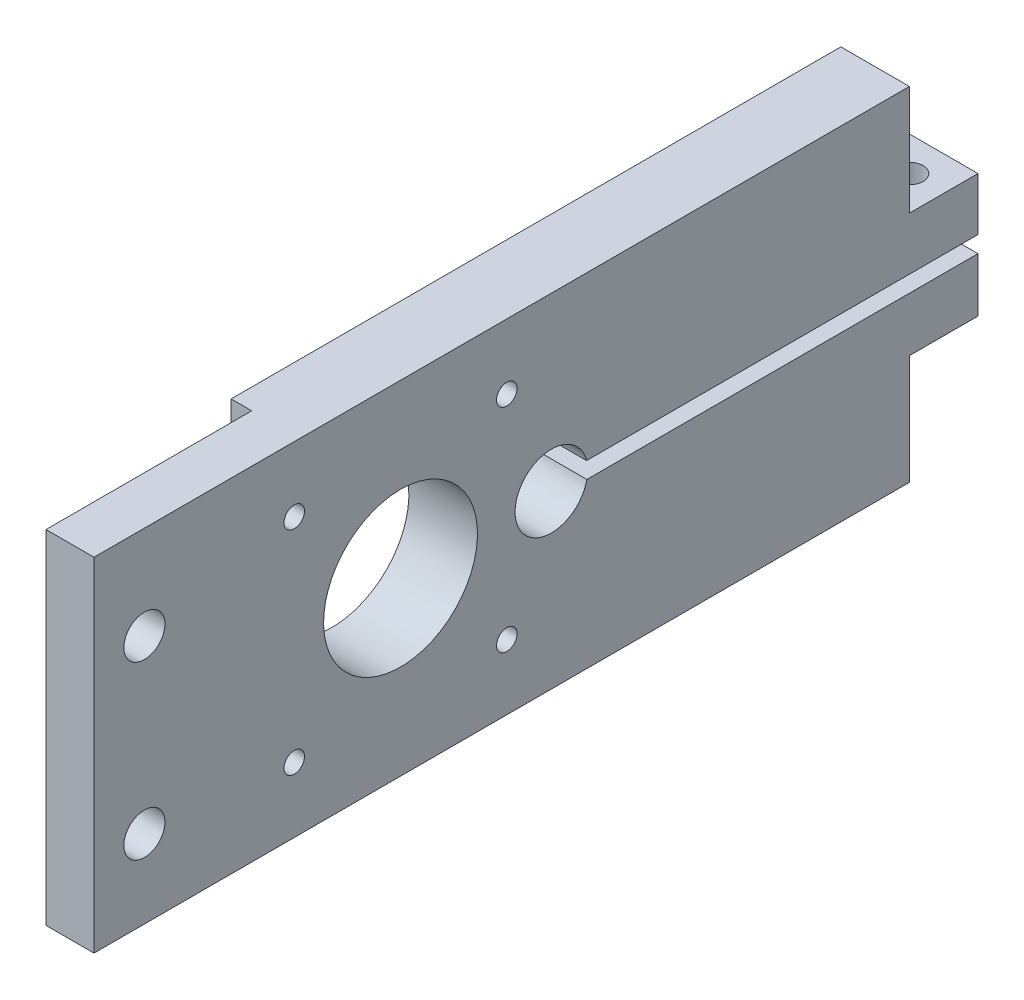
ISO-10303-21;
HEADER;
FILE_DESCRIPTION(('STEP AP214'),'2;1');
FILE_NAME('part.step','',(''),(''),'','','');
FILE_SCHEMA(('AUTOMOTIVE_DESIGN { 1 0 10303 214 1 1 1 1 }'));
ENDSEC;
DATA;
#1=APPLICATION_CONTEXT('core data for automotive mechanical design processes');
#2=APPLICATION_PROTOCOL_DEFINITION('international standard','automotive_design',2000,#1);
#3=PRODUCT_CONTEXT('',#1,'mechanical');
#4=PRODUCT('Part','Part','',(#3));
#5=PRODUCT_RELATED_PRODUCT_CATEGORY('part','',(#4));
#6=PRODUCT_DEFINITION_FORMATION('','',#4);
#7=PRODUCT_DEFINITION_CONTEXT('part definition',#1,'design');
#8=PRODUCT_DEFINITION('design','',#6,#7);
#9=PRODUCT_DEFINITION_SHAPE('','',#8);
#10=(LENGTH_UNIT() NAMED_UNIT(*) SI_UNIT(.MILLI.,.METRE.));
#11=(NAMED_UNIT(*) PLANE_ANGLE_UNIT() SI_UNIT($,.RADIAN.));
#12=(NAMED_UNIT(*) SI_UNIT($,.STERADIAN.) SOLID_ANGLE_UNIT());
#13=UNCERTAINTY_MEASURE_WITH_UNIT(LENGTH_MEASURE(1.E-05),#10,'distance_accuracy_value','');
#14=(GEOMETRIC_REPRESENTATION_CONTEXT(3) GLOBAL_UNCERTAINTY_ASSIGNED_CONTEXT((#13)) GLOBAL_UNIT_ASSIGNED_CONTEXT((#10,
#11,#12)) REPRESENTATION_CONTEXT('',''));
#15=CARTESIAN_POINT('',(0.,0.,0.));
#16=DIRECTION('',(0.,0.,1.));
#17=DIRECTION('',(1.,0.,0.));
#18=AXIS2_PLACEMENT_3D('',#15,#16,#17);
#19=CARTESIAN_POINT('',(76.0000000000001,0.,0.));
#20=DIRECTION('',(1.,0.,0.));
#21=DIRECTION('',(0.,1.,0.));
#22=AXIS2_PLACEMENT_3D('',#19,#20,#21);
#23=PLANE('',#22);
#24=DIRECTION('',(0.,0.,-1.));
#25=VECTOR('',#24,1.);
#26=CARTESIAN_POINT('',(76.0000000000001,266.,-111.216548797109));
#27=LINE('',#26,#25);
#28=CARTESIAN_POINT('',(76.0000000000001,266.,-101.216548797109));
#29=VERTEX_POINT('',#28);
#30=CARTESIAN_POINT('',(76.0000000000001,266.,-111.216548797109));
#31=VERTEX_POINT('',#30);
#32=EDGE_CURVE('E168',#29,#31,#27,.T.);
#33=ORIENTED_EDGE('',*,*,#32,.T.);
#34=DIRECTION('',(0.,-1.,0.));
#35=VECTOR('',#34,1.);
#36=CARTESIAN_POINT('',(76.0000000000001,273.885605854486,-111.216548797109));
#37=LINE('',#36,#35);
#38=CARTESIAN_POINT('',(76.0000000000001,273.885605854486,-111.216548797109));
#39=VERTEX_POINT('',#38);
#40=EDGE_CURVE('E248',#39,#31,#37,.T.);
#41=ORIENTED_EDGE('',*,*,#40,.F.);
#42=DIRECTION('',(0.,0.,-1.));
#43=VECTOR('',#42,1.);
#44=CARTESIAN_POINT('',(76.0000000000001,273.885605854486,-49.5274257157044));
#45=LINE('',#44,#43);
#46=CARTESIAN_POINT('',(76.0000000000001,273.885605854486,-54.1768743402864));
#47=VERTEX_POINT('',#46);
#48=EDGE_CURVE('E256',#47,#39,#45,.T.);
#49=ORIENTED_EDGE('',*,*,#48,.F.);
#50=CARTESIAN_POINT('',(76.0000000000001,275.000000000006,-48.9999999999999));
#51=DIRECTION('',(1.,0.,0.));
#52=DIRECTION('',(0.,1.,0.));
#53=AXIS2_PLACEMENT_3D('',#50,#51,#52);
#54=CIRCLE('',#53,5.29546053206766);
#55=CARTESIAN_POINT('',(76.0000000000001,276.289745616525,-54.1359963484562));
#56=VERTEX_POINT('',#55);
#57=EDGE_CURVE('E294',#56,#47,#54,.T.);
#58=ORIENTED_EDGE('',*,*,#57,.F.);
#59=DIRECTION('',(0.,0.,1.));
#60=VECTOR('',#59,1.);
#61=CARTESIAN_POINT('',(76.0000000000002,276.289745616525,-108.216548797109));
#62=LINE('',#61,#60);
#63=CARTESIAN_POINT('',(76.0000000000002,276.289745616525,-111.216548797109));
#64=VERTEX_POINT('',#63);
#65=EDGE_CURVE('E251',#64,#56,#62,.T.);
#66=ORIENTED_EDGE('',*,*,#65,.F.);
#67=DIRECTION('',(0.,-1.,0.));
#68=VECTOR('',#67,1.);
#69=CARTESIAN_POINT('',(76.0000000000001,300.000000000006,-111.216548797109));
#70=LINE('',#69,#68);
#71=CARTESIAN_POINT('',(76.0000000000002,284.000000000006,-111.216548797109));
#72=VERTEX_POINT('',#71);
#73=EDGE_CURVE('E235',#72,#64,#70,.T.);
#74=ORIENTED_EDGE('',*,*,#73,.F.);
#75=DIRECTION('',(0.,0.,1.));
#76=VECTOR('',#75,1.);
#77=CARTESIAN_POINT('',(76.0000000000002,284.000000000006,-111.216548797109));
#78=LINE('',#77,#76);
#79=CARTESIAN_POINT('',(76.0000000000002,284.000000000006,-101.216548797109));
#80=VERTEX_POINT('',#79);
#81=EDGE_CURVE('E57',#72,#80,#78,.T.);
#82=ORIENTED_EDGE('',*,*,#81,.T.);
#83=DIRECTION('',(0.,1.,0.));
#84=VECTOR('',#83,1.);
#85=CARTESIAN_POINT('',(76.0000000000002,300.000000000006,-101.216548797109));
#86=LINE('',#85,#84);
#87=CARTESIAN_POINT('',(76.0000000000002,300.000000000006,-101.216548797109));
#88=VERTEX_POINT('',#87);
#89=EDGE_CURVE('E231',#80,#88,#86,.T.);
#90=ORIENTED_EDGE('',*,*,#89,.T.);
#91=DIRECTION('',(0.,0.,1.));
#92=VECTOR('',#91,1.);
#93=CARTESIAN_POINT('',(76.0000000000001,300.000000000006,-47.9999999999999));
#94=LINE('',#93,#92);
#95=CARTESIAN_POINT('',(76.0000000000002,300.000000000006,17.7021500089913));
#96=VERTEX_POINT('',#95);
#97=EDGE_CURVE('E184',#88,#96,#94,.T.);
#98=ORIENTED_EDGE('',*,*,#97,.T.);
#99=DIRECTION('',(0.,-1.,0.));
#100=VECTOR('',#99,1.);
#101=CARTESIAN_POINT('',(76.0000000000002,300.000000000006,17.7021500089913));
#102=LINE('',#101,#100);
#103=CARTESIAN_POINT('',(76.0000000000001,250.000000000006,17.7021500089913));
#104=VERTEX_POINT('',#103);
#105=EDGE_CURVE('E182',#96,#104,#102,.T.);
#106=ORIENTED_EDGE('',*,*,#105,.T.);
#107=DIRECTION('',(0.,0.,-1.));
#108=VECTOR('',#107,1.);
#109=CARTESIAN_POINT('',(76.0000000000001,250.,-108.216548797109));
#110=LINE('',#109,#108);
#111=CARTESIAN_POINT('',(76.0000000000001,250.,-101.216548797109));
#112=VERTEX_POINT('',#111);
#113=EDGE_CURVE('E174',#104,#112,#110,.T.);
#114=ORIENTED_EDGE('',*,*,#113,.T.);
#115=DIRECTION('',(0.,1.,0.));
#116=VECTOR('',#115,1.);
#117=CARTESIAN_POINT('',(76.0000000000001,250.,-101.216548797109));
#118=LINE('',#117,#116);
#119=EDGE_CURVE('E157',#112,#29,#118,.T.);
#120=ORIENTED_EDGE('',*,*,#119,.T.);
#121=EDGE_LOOP('',(#33,#41,#49,#58,#66,#74,#82,#90,#98,#106,#114,#120));
#122=FACE_BOUND('',#121,.T.);
#123=CARTESIAN_POINT('',(76.0000000000001,261.401714799848,10.3510750044957));
#124=DIRECTION('',(1.,0.,0.));
#125=DIRECTION('',(0.,1.,0.));
#126=AXIS2_PLACEMENT_3D('',#123,#124,#125);
#127=CIRCLE('',#126,3.00000000000185);
#128=CARTESIAN_POINT('',(76.0000000000001,264.40171479985,10.3510750044957));
#129=VERTEX_POINT('',#128);
#130=EDGE_CURVE('E297',#129,#129,#127,.T.);
#131=ORIENTED_EDGE('',*,*,#130,.F.);
#132=EDGE_LOOP('',(#131));
#133=FACE_BOUND('',#132,.T.);
#134=CARTESIAN_POINT('',(76.0000000000001,275.000000000006,-26.9999999999999));
#135=DIRECTION('',(1.,0.,0.));
#136=DIRECTION('',(0.,1.,0.));
#137=AXIS2_PLACEMENT_3D('',#134,#135,#136);
#138=CIRCLE('',#137,11.2232575209576);
#139=CARTESIAN_POINT('',(76.0000000000001,286.223257520963,-26.9999999999999));
#140=VERTEX_POINT('',#139);
#141=EDGE_CURVE('E306',#140,#140,#138,.T.);
#142=ORIENTED_EDGE('',*,*,#141,.F.);
#143=EDGE_LOOP('',(#142));
#144=FACE_BOUND('',#143,.T.);
#145=CARTESIAN_POINT('',(76.0000000000001,259.500000000006,-11.4999999999997));
#146=DIRECTION('',(1.,0.,0.));
#147=DIRECTION('',(0.,1.,0.));
#148=AXIS2_PLACEMENT_3D('',#145,#146,#147);
#149=CIRCLE('',#148,1.50000000000001);
#150=CARTESIAN_POINT('',(76.0000000000001,261.000000000006,-11.4999999999997));
#151=VERTEX_POINT('',#150);
#152=EDGE_CURVE('E318',#151,#151,#149,.T.);
#153=ORIENTED_EDGE('',*,*,#152,.F.);
#154=EDGE_LOOP('',(#153));
#155=FACE_BOUND('',#154,.T.);
#156=CARTESIAN_POINT('',(76.0000000000001,259.500000000006,-42.4999999999997));
#157=DIRECTION('',(1.,0.,0.));
#158=DIRECTION('',(0.,1.,0.));
#159=AXIS2_PLACEMENT_3D('',#156,#157,#158);
#160=CIRCLE('',#159,1.49999999999995);
#161=CARTESIAN_POINT('',(76.0000000000001,261.000000000006,-42.4999999999997));
#162=VERTEX_POINT('',#161);
#163=EDGE_CURVE('E195',#162,#162,#160,.T.);
#164=ORIENTED_EDGE('',*,*,#163,.F.);
#165=EDGE_LOOP('',(#164));
#166=FACE_BOUND('',#165,.T.);
#167=CARTESIAN_POINT('',(76.0000000000001,290.500000000006,-42.4999999999999));
#168=DIRECTION('',(1.,0.,0.));
#169=DIRECTION('',(0.,1.,0.));
#170=AXIS2_PLACEMENT_3D('',#167,#168,#169);
#171=CIRCLE('',#170,1.49999999999995);
#172=CARTESIAN_POINT('',(76.0000000000001,292.000000000006,-42.4999999999999));
#173=VERTEX_POINT('',#172);
#174=EDGE_CURVE('E324',#173,#173,#171,.T.);
#175=ORIENTED_EDGE('',*,*,#174,.F.);
#176=EDGE_LOOP('',(#175));
#177=FACE_BOUND('',#176,.T.);
#178=CARTESIAN_POINT('',(76.0000000000001,290.500000000006,-11.4999999999999));
#179=DIRECTION('',(1.,0.,0.));
#180=DIRECTION('',(0.,1.,0.));
#181=AXIS2_PLACEMENT_3D('',#178,#179,#180);
#182=CIRCLE('',#181,1.50000000000001);
#183=CARTESIAN_POINT('',(76.0000000000001,292.000000000006,-11.4999999999999));
#184=VERTEX_POINT('',#183);
#185=EDGE_CURVE('E312',#184,#184,#182,.T.);
#186=ORIENTED_EDGE('',*,*,#185,.F.);
#187=EDGE_LOOP('',(#186));
#188=FACE_BOUND('',#187,.T.);
#189=CARTESIAN_POINT('',(76.0000000000001,286.401714799848,10.3510750044957));
#190=DIRECTION('',(1.,0.,0.));
#191=DIRECTION('',(0.,1.,0.));
#192=AXIS2_PLACEMENT_3D('',#189,#190,#191);
#193=CIRCLE('',#192,3.00000000000185);
#194=CARTESIAN_POINT('',(76.0000000000001,289.40171479985,10.3510750044957));
#195=VERTEX_POINT('',#194);
#196=EDGE_CURVE('E302',#195,#195,#193,.T.);
#197=ORIENTED_EDGE('',*,*,#196,.F.);
#198=EDGE_LOOP('',(#197));
#199=FACE_BOUND('',#198,.T.);
#200=ADVANCED_FACE('F32',(#122,#133,#144,#155,#166,#177,#188,#199),#23,.T.);
#201=CARTESIAN_POINT('',(66.0000000000001,0.,0.));
#202=DIRECTION('',(1.,0.,0.));
#203=DIRECTION('',(0.,1.,0.));
#204=AXIS2_PLACEMENT_3D('',#201,#202,#203);
#205=PLANE('',#204);
#206=CARTESIAN_POINT('',(66.0000000000001,259.500000000006,-42.4999999999997));
#207=DIRECTION('',(1.,0.,0.));
#208=DIRECTION('',(0.,1.,0.));
#209=AXIS2_PLACEMENT_3D('',#206,#207,#208);
#210=CIRCLE('',#209,1.49999999999995);
#211=CARTESIAN_POINT('',(66.0000000000001,261.000000000006,-42.4999999999997));
#212=VERTEX_POINT('',#211);
#213=EDGE_CURVE('E190',#212,#212,#210,.T.);
#214=ORIENTED_EDGE('',*,*,#213,.T.);
#215=EDGE_LOOP('',(#214));
#216=FACE_BOUND('',#215,.T.);
#217=CARTESIAN_POINT('',(66.0000000000001,290.500000000006,-42.4999999999999));
#218=DIRECTION('',(1.,0.,0.));
#219=DIRECTION('',(0.,1.,0.));
#220=AXIS2_PLACEMENT_3D('',#217,#218,#219);
#221=CIRCLE('',#220,1.49999999999995);
#222=CARTESIAN_POINT('',(66.0000000000001,292.000000000006,-42.4999999999999));
#223=VERTEX_POINT('',#222);
#224=EDGE_CURVE('E321',#223,#223,#221,.T.);
#225=ORIENTED_EDGE('',*,*,#224,.T.);
#226=EDGE_LOOP('',(#225));
#227=FACE_BOUND('',#226,.T.);
#228=DIRECTION('',(0.,1.,0.));
#229=VECTOR('',#228,1.);
#230=CARTESIAN_POINT('',(66.0000000000001,250.,-111.216548797109));
#231=LINE('',#230,#229);
#232=CARTESIAN_POINT('',(66.0000000000001,266.,-111.216548797109));
#233=VERTEX_POINT('',#232);
#234=CARTESIAN_POINT('',(66.0000000000001,273.885605854486,-111.216548797109));
#235=VERTEX_POINT('',#234);
#236=EDGE_CURVE('E243',#233,#235,#231,.T.);
#237=ORIENTED_EDGE('',*,*,#236,.F.);
#238=DIRECTION('',(0.,0.,-1.));
#239=VECTOR('',#238,1.);
#240=CARTESIAN_POINT('',(66.0000000000001,266.,-111.216548797109));
#241=LINE('',#240,#239);
#242=CARTESIAN_POINT('',(66.0000000000001,266.,-101.216548797109));
#243=VERTEX_POINT('',#242);
#244=EDGE_CURVE('E49',#243,#233,#241,.T.);
#245=ORIENTED_EDGE('',*,*,#244,.F.);
#246=DIRECTION('',(0.,1.,0.));
#247=VECTOR('',#246,1.);
#248=CARTESIAN_POINT('',(66.0000000000001,250.,-101.216548797109));
#249=LINE('',#248,#247);
#250=CARTESIAN_POINT('',(66.0000000000001,250.,-101.216548797109));
#251=VERTEX_POINT('',#250);
#252=EDGE_CURVE('E376',#251,#243,#249,.T.);
#253=ORIENTED_EDGE('',*,*,#252,.F.);
#254=DIRECTION('',(0.,0.,-1.));
#255=VECTOR('',#254,1.);
#256=CARTESIAN_POINT('',(66.0000000000001,250.000000000006,-47.9999999999999));
#257=LINE('',#256,#255);
#258=CARTESIAN_POINT('',(66.0000000000001,250.000000000006,-12.2978499910087));
#259=VERTEX_POINT('',#258);
#260=EDGE_CURVE('E178',#259,#251,#257,.T.);
#261=ORIENTED_EDGE('',*,*,#260,.F.);
#262=DIRECTION('',(0.,-1.,0.));
#263=VECTOR('',#262,1.);
#264=CARTESIAN_POINT('',(66.0000000000002,300.000000000006,-12.2978499910087));
#265=LINE('',#264,#263);
#266=CARTESIAN_POINT('',(66.0000000000001,258.229789233303,-12.2978499910087));
#267=VERTEX_POINT('',#266);
#268=EDGE_CURVE('E269',#267,#259,#265,.T.);
#269=ORIENTED_EDGE('',*,*,#268,.F.);
#270=CARTESIAN_POINT('',(66.0000000000001,259.500000000006,-11.4999999999997));
#271=DIRECTION('',(1.,0.,0.));
#272=DIRECTION('',(0.,1.,0.));
#273=AXIS2_PLACEMENT_3D('',#270,#271,#272);
#274=CIRCLE('',#273,1.50000000000001);
#275=CARTESIAN_POINT('',(66.0000000000001,260.770210766708,-12.2978499910087));
#276=VERTEX_POINT('',#275);
#277=EDGE_CURVE('E315',#267,#276,#274,.T.);
#278=ORIENTED_EDGE('',*,*,#277,.T.);
#279=CARTESIAN_POINT('',(66.0000000000002,289.229789233303,-12.2978499910087));
#280=VERTEX_POINT('',#279);
#281=EDGE_CURVE('E282',#280,#276,#265,.T.);
#282=ORIENTED_EDGE('',*,*,#281,.F.);
#283=CARTESIAN_POINT('',(66.0000000000001,290.500000000006,-11.4999999999999));
#284=DIRECTION('',(1.,0.,0.));
#285=DIRECTION('',(0.,1.,0.));
#286=AXIS2_PLACEMENT_3D('',#283,#284,#285);
#287=CIRCLE('',#286,1.50000000000001);
#288=CARTESIAN_POINT('',(66.0000000000001,291.770210766709,-12.2978499910087));
#289=VERTEX_POINT('',#288);
#290=EDGE_CURVE('E309',#280,#289,#287,.T.);
#291=ORIENTED_EDGE('',*,*,#290,.T.);
#292=CARTESIAN_POINT('',(66.0000000000002,300.000000000006,-12.2978499910087));
#293=VERTEX_POINT('',#292);
#294=EDGE_CURVE('E280',#293,#289,#265,.T.);
#295=ORIENTED_EDGE('',*,*,#294,.F.);
#296=DIRECTION('',(0.,0.,1.));
#297=VECTOR('',#296,1.);
#298=CARTESIAN_POINT('',(66.0000000000001,300.000000000006,3.00000000000014));
#299=LINE('',#298,#297);
#300=CARTESIAN_POINT('',(66.0000000000002,300.000000000006,-101.216548797109));
#301=VERTEX_POINT('',#300);
#302=EDGE_CURVE('E187',#301,#293,#299,.T.);
#303=ORIENTED_EDGE('',*,*,#302,.F.);
#304=DIRECTION('',(0.,1.,0.));
#305=VECTOR('',#304,1.);
#306=CARTESIAN_POINT('',(66.0000000000002,300.000000000006,-101.216548797109));
#307=LINE('',#306,#305);
#308=CARTESIAN_POINT('',(66.0000000000002,284.000000000006,-101.216548797109));
#309=VERTEX_POINT('',#308);
#310=EDGE_CURVE('E228',#309,#301,#307,.T.);
#311=ORIENTED_EDGE('',*,*,#310,.F.);
#312=DIRECTION('',(0.,0.,1.));
#313=VECTOR('',#312,1.);
#314=CARTESIAN_POINT('',(66.0000000000002,284.000000000006,-111.216548797109));
#315=LINE('',#314,#313);
#316=CARTESIAN_POINT('',(66.0000000000002,284.000000000006,-111.216548797109));
#317=VERTEX_POINT('',#316);
#318=EDGE_CURVE('E386',#317,#309,#315,.T.);
#319=ORIENTED_EDGE('',*,*,#318,.F.);
#320=DIRECTION('',(0.,1.,0.));
#321=VECTOR('',#320,1.);
#322=CARTESIAN_POINT('',(66.0000000000002,276.289745616525,-111.216548797109));
#323=LINE('',#322,#321);
#324=CARTESIAN_POINT('',(66.0000000000002,276.289745616525,-111.216548797109));
#325=VERTEX_POINT('',#324);
#326=EDGE_CURVE('E240',#325,#317,#323,.T.);
#327=ORIENTED_EDGE('',*,*,#326,.F.);
#328=DIRECTION('',(0.,0.,1.));
#329=VECTOR('',#328,1.);
#330=CARTESIAN_POINT('',(66.0000000000002,276.289745616525,-109.527425715704));
#331=LINE('',#330,#329);
#332=CARTESIAN_POINT('',(66.0000000000002,276.289745616525,-54.1359963484562));
#333=VERTEX_POINT('',#332);
#334=EDGE_CURVE('E252',#325,#333,#331,.T.);
#335=ORIENTED_EDGE('',*,*,#334,.T.);
#336=CARTESIAN_POINT('',(66.0000000000001,275.000000000006,-48.9999999999999));
#337=DIRECTION('',(1.,0.,0.));
#338=DIRECTION('',(0.,1.,0.));
#339=AXIS2_PLACEMENT_3D('',#336,#337,#338);
#340=CIRCLE('',#339,5.29546053206766);
#341=CARTESIAN_POINT('',(66.0000000000001,273.885605854486,-54.1768743402864));
#342=VERTEX_POINT('',#341);
#343=EDGE_CURVE('E293',#333,#342,#340,.T.);
#344=ORIENTED_EDGE('',*,*,#343,.T.);
#345=DIRECTION('',(0.,0.,-1.));
#346=VECTOR('',#345,1.);
#347=CARTESIAN_POINT('',(66.0000000000001,273.885605854486,-49.5274257157044));
#348=LINE('',#347,#346);
#349=EDGE_CURVE('E255',#342,#235,#348,.T.);
#350=ORIENTED_EDGE('',*,*,#349,.T.);
#351=EDGE_LOOP('',(#237,#245,#253,#261,#269,#278,#282,#291,#295,#303,#311,#319,#327,#335,#344,#350));
#352=FACE_BOUND('',#351,.T.);
#353=CARTESIAN_POINT('',(66.0000000000001,275.000000000006,-26.9999999999999));
#354=DIRECTION('',(1.,0.,0.));
#355=DIRECTION('',(0.,1.,0.));
#356=AXIS2_PLACEMENT_3D('',#353,#354,#355);
#357=CIRCLE('',#356,11.2232575209576);
#358=CARTESIAN_POINT('',(66.0000000000001,286.223257520963,-26.9999999999999));
#359=VERTEX_POINT('',#358);
#360=EDGE_CURVE('E305',#359,#359,#357,.T.);
#361=ORIENTED_EDGE('',*,*,#360,.T.);
#362=EDGE_LOOP('',(#361));
#363=FACE_BOUND('',#362,.T.);
#364=ADVANCED_FACE('F334',(#216,#227,#352,#363),#205,.F.);
#365=CARTESIAN_POINT('',(76.0000000000001,300.000000000006,3.00000000000014));
#366=DIRECTION('',(0.,-1.,0.));
#367=DIRECTION('',(1.,0.,0.));
#368=AXIS2_PLACEMENT_3D('',#365,#366,#367);
#369=PLANE('',#368);
#370=ORIENTED_EDGE('',*,*,#97,.F.);
#371=DIRECTION('',(-1.,0.,0.));
#372=VECTOR('',#371,1.);
#373=CARTESIAN_POINT('',(76.0000000000002,300.000000000006,-101.216548797109));
#374=LINE('',#373,#372);
#375=EDGE_CURVE('E213',#88,#301,#374,.T.);
#376=ORIENTED_EDGE('',*,*,#375,.T.);
#377=ORIENTED_EDGE('',*,*,#302,.T.);
#378=DIRECTION('',(1.,0.,0.));
#379=VECTOR('',#378,1.);
#380=CARTESIAN_POINT('',(69.0000000000003,300.000000000006,-12.2978499910087));
#381=LINE('',#380,#379);
#382=CARTESIAN_POINT('',(69.0000000000003,300.000000000006,-12.2978499910087));
#383=VERTEX_POINT('',#382);
#384=EDGE_CURVE('E262',#293,#383,#381,.T.);
#385=ORIENTED_EDGE('',*,*,#384,.T.);
#386=DIRECTION('',(0.,0.,1.));
#387=VECTOR('',#386,1.);
#388=CARTESIAN_POINT('',(69.0000000000003,300.000000000006,17.7021500089913));
#389=LINE('',#388,#387);
#390=CARTESIAN_POINT('',(69.0000000000003,300.000000000006,17.7021500089913));
#391=VERTEX_POINT('',#390);
#392=EDGE_CURVE('E265',#383,#391,#389,.T.);
#393=ORIENTED_EDGE('',*,*,#392,.T.);
#394=DIRECTION('',(-1.,0.,0.));
#395=VECTOR('',#394,1.);
#396=CARTESIAN_POINT('',(76.0000000000002,300.000000000006,17.7021500089913));
#397=LINE('',#396,#395);
#398=EDGE_CURVE('E198',#96,#391,#397,.T.);
#399=ORIENTED_EDGE('',*,*,#398,.F.);
#400=EDGE_LOOP('',(#370,#376,#377,#385,#393,#399));
#401=FACE_BOUND('',#400,.T.);
#402=ADVANCED_FACE('F34',(#401),#369,.F.);
#403=CARTESIAN_POINT('',(76.0000000000002,300.000000000006,17.7021500089913));
#404=DIRECTION('',(0.,0.,-1.));
#405=DIRECTION('',(0.,1.,0.));
#406=AXIS2_PLACEMENT_3D('',#403,#404,#405);
#407=PLANE('',#406);
#408=ORIENTED_EDGE('',*,*,#398,.T.);
#409=DIRECTION('',(0.,-1.,0.));
#410=VECTOR('',#409,1.);
#411=CARTESIAN_POINT('',(69.0000000000003,300.000000000006,17.7021500089913));
#412=LINE('',#411,#410);
#413=CARTESIAN_POINT('',(69.0000000000003,250.000000000006,17.7021500089913));
#414=VERTEX_POINT('',#413);
#415=EDGE_CURVE('E206',#391,#414,#412,.T.);
#416=ORIENTED_EDGE('',*,*,#415,.T.);
#417=DIRECTION('',(-1.,0.,0.));
#418=VECTOR('',#417,1.);
#419=CARTESIAN_POINT('',(76.0000000000001,250.000000000006,17.7021500089913));
#420=LINE('',#419,#418);
#421=EDGE_CURVE('E194',#104,#414,#420,.T.);
#422=ORIENTED_EDGE('',*,*,#421,.F.);
#423=ORIENTED_EDGE('',*,*,#105,.F.);
#424=EDGE_LOOP('',(#408,#416,#422,#423));
#425=FACE_BOUND('',#424,.T.);
#426=ADVANCED_FACE('F348',(#425),#407,.F.);
#427=CARTESIAN_POINT('',(76.0000000000001,250.000000000006,-47.9999999999999));
#428=DIRECTION('',(0.,1.,0.));
#429=DIRECTION('',(-1.,0.,0.));
#430=AXIS2_PLACEMENT_3D('',#427,#428,#429);
#431=PLANE('',#430);
#432=ORIENTED_EDGE('',*,*,#260,.T.);
#433=DIRECTION('',(-1.,0.,0.));
#434=VECTOR('',#433,1.);
#435=CARTESIAN_POINT('',(76.0000000000001,250.,-101.216548797109));
#436=LINE('',#435,#434);
#437=EDGE_CURVE('E161',#112,#251,#436,.T.);
#438=ORIENTED_EDGE('',*,*,#437,.F.);
#439=ORIENTED_EDGE('',*,*,#113,.F.);
#440=ORIENTED_EDGE('',*,*,#421,.T.);
#441=DIRECTION('',(0.,0.,1.));
#442=VECTOR('',#441,1.);
#443=CARTESIAN_POINT('',(69.0000000000003,250.000000000006,17.7021500089913));
#444=LINE('',#443,#442);
#445=CARTESIAN_POINT('',(69.0000000000003,250.000000000006,-12.2978499910087));
#446=VERTEX_POINT('',#445);
#447=EDGE_CURVE('E266',#446,#414,#444,.T.);
#448=ORIENTED_EDGE('',*,*,#447,.F.);
#449=DIRECTION('',(1.,0.,0.));
#450=VECTOR('',#449,1.);
#451=CARTESIAN_POINT('',(69.0000000000003,250.000000000006,-12.2978499910087));
#452=LINE('',#451,#450);
#453=EDGE_CURVE('E259',#259,#446,#452,.T.);
#454=ORIENTED_EDGE('',*,*,#453,.F.);
#455=EDGE_LOOP('',(#432,#438,#439,#440,#448,#454));
#456=FACE_BOUND('',#455,.T.);
#457=ADVANCED_FACE('F172',(#456),#431,.F.);
#458=CARTESIAN_POINT('',(76.0000000000001,259.500000000006,-42.4999999999997));
#459=DIRECTION('',(-1.,0.,0.));
#460=DIRECTION('',(0.,-1.,0.));
#461=AXIS2_PLACEMENT_3D('',#458,#459,#460);
#462=CYLINDRICAL_SURFACE('',#461,1.49999999999995);
#463=ORIENTED_EDGE('',*,*,#163,.T.);
#464=EDGE_LOOP('',(#463));
#465=FACE_BOUND('',#464,.T.);
#466=ORIENTED_EDGE('',*,*,#213,.F.);
#467=EDGE_LOOP('',(#466));
#468=FACE_BOUND('',#467,.T.);
#469=ADVANCED_FACE('F337',(#465,#468),#462,.F.);
#470=CARTESIAN_POINT('',(76.0000000000001,290.500000000006,-42.4999999999999));
#471=DIRECTION('',(-1.,0.,0.));
#472=DIRECTION('',(0.,-1.,0.));
#473=AXIS2_PLACEMENT_3D('',#470,#471,#472);
#474=CYLINDRICAL_SURFACE('',#473,1.49999999999995);
#475=ORIENTED_EDGE('',*,*,#174,.T.);
#476=EDGE_LOOP('',(#475));
#477=FACE_BOUND('',#476,.T.);
#478=ORIENTED_EDGE('',*,*,#224,.F.);
#479=EDGE_LOOP('',(#478));
#480=FACE_BOUND('',#479,.T.);
#481=ADVANCED_FACE('F339',(#477,#480),#474,.F.);
#482=CARTESIAN_POINT('',(76.0000000000001,259.500000000006,-11.4999999999997));
#483=DIRECTION('',(-1.,0.,0.));
#484=DIRECTION('',(0.,-1.,0.));
#485=AXIS2_PLACEMENT_3D('',#482,#483,#484);
#486=CYLINDRICAL_SURFACE('',#485,1.50000000000001);
#487=DIRECTION('',(-1.,0.,0.));
#488=VECTOR('',#487,1.);
#489=CARTESIAN_POINT('',(76.0000000000001,258.229789233303,-12.2978499910087));
#490=LINE('',#489,#488);
#491=CARTESIAN_POINT('',(69.0000000000003,258.229789233303,-12.2978499910087));
#492=VERTEX_POINT('',#491);
#493=EDGE_CURVE('E291',#492,#267,#490,.T.);
#494=ORIENTED_EDGE('',*,*,#493,.F.);
#495=CARTESIAN_POINT('',(69.0000000000003,259.500000000006,-11.4999999999997));
#496=DIRECTION('',(1.,0.,0.));
#497=DIRECTION('',(0.,0.,-1.));
#498=AXIS2_PLACEMENT_3D('',#495,#496,#497);
#499=CIRCLE('',#498,1.50000000000001);
#500=CARTESIAN_POINT('',(69.0000000000003,260.770210766708,-12.2978499910087));
#501=VERTEX_POINT('',#500);
#502=EDGE_CURVE('E287',#501,#492,#499,.T.);
#503=ORIENTED_EDGE('',*,*,#502,.F.);
#504=DIRECTION('',(-1.,0.,0.));
#505=VECTOR('',#504,1.);
#506=CARTESIAN_POINT('',(76.0000000000001,260.770210766708,-12.2978499910087));
#507=LINE('',#506,#505);
#508=EDGE_CURVE('E289',#276,#501,#507,.F.);
#509=ORIENTED_EDGE('',*,*,#508,.F.);
#510=ORIENTED_EDGE('',*,*,#277,.F.);
#511=EDGE_LOOP('',(#494,#503,#509,#510));
#512=FACE_BOUND('',#511,.T.);
#513=ORIENTED_EDGE('',*,*,#152,.T.);
#514=EDGE_LOOP('',(#513));
#515=FACE_BOUND('',#514,.T.);
#516=ADVANCED_FACE('F345',(#512,#515),#486,.F.);
#517=CARTESIAN_POINT('',(76.0000000000001,290.500000000006,-11.4999999999999));
#518=DIRECTION('',(-1.,0.,0.));
#519=DIRECTION('',(0.,-1.,0.));
#520=AXIS2_PLACEMENT_3D('',#517,#518,#519);
#521=CYLINDRICAL_SURFACE('',#520,1.50000000000001);
#522=DIRECTION('',(-1.,0.,0.));
#523=VECTOR('',#522,1.);
#524=CARTESIAN_POINT('',(76.0000000000001,289.229789233303,-12.2978499910087));
#525=LINE('',#524,#523);
#526=CARTESIAN_POINT('',(69.0000000000003,289.229789233303,-12.2978499910087));
#527=VERTEX_POINT('',#526);
#528=EDGE_CURVE('E208',#527,#280,#525,.T.);
#529=ORIENTED_EDGE('',*,*,#528,.F.);
#530=CARTESIAN_POINT('',(69.0000000000003,290.500000000006,-11.4999999999999));
#531=DIRECTION('',(1.,0.,0.));
#532=DIRECTION('',(0.,0.,-1.));
#533=AXIS2_PLACEMENT_3D('',#530,#531,#532);
#534=CIRCLE('',#533,1.50000000000001);
#535=CARTESIAN_POINT('',(69.0000000000003,291.770210766709,-12.2978499910087));
#536=VERTEX_POINT('',#535);
#537=EDGE_CURVE('E285',#536,#527,#534,.T.);
#538=ORIENTED_EDGE('',*,*,#537,.F.);
#539=DIRECTION('',(-1.,0.,0.));
#540=VECTOR('',#539,1.);
#541=CARTESIAN_POINT('',(76.0000000000001,291.770210766709,-12.2978499910087));
#542=LINE('',#541,#540);
#543=EDGE_CURVE('E201',#289,#536,#542,.F.);
#544=ORIENTED_EDGE('',*,*,#543,.F.);
#545=ORIENTED_EDGE('',*,*,#290,.F.);
#546=EDGE_LOOP('',(#529,#538,#544,#545));
#547=FACE_BOUND('',#546,.T.);
#548=ORIENTED_EDGE('',*,*,#185,.T.);
#549=EDGE_LOOP('',(#548));
#550=FACE_BOUND('',#549,.T.);
#551=ADVANCED_FACE('F453',(#547,#550),#521,.F.);
#552=CARTESIAN_POINT('',(76.0000000000001,275.000000000006,-26.9999999999999));
#553=DIRECTION('',(-1.,0.,0.));
#554=DIRECTION('',(0.,-1.,0.));
#555=AXIS2_PLACEMENT_3D('',#552,#553,#554);
#556=CYLINDRICAL_SURFACE('',#555,11.2232575209576);
#557=ORIENTED_EDGE('',*,*,#141,.T.);
#558=EDGE_LOOP('',(#557));
#559=FACE_BOUND('',#558,.T.);
#560=ORIENTED_EDGE('',*,*,#360,.F.);
#561=EDGE_LOOP('',(#560));
#562=FACE_BOUND('',#561,.T.);
#563=ADVANCED_FACE('F449',(#559,#562),#556,.F.);
#564=CARTESIAN_POINT('',(76.0000000000001,286.401714799848,10.3510750044957));
#565=DIRECTION('',(-1.,0.,0.));
#566=DIRECTION('',(0.,-1.,0.));
#567=AXIS2_PLACEMENT_3D('',#564,#565,#566);
#568=CYLINDRICAL_SURFACE('',#567,3.00000000000185);
#569=CARTESIAN_POINT('',(69.0000000000003,286.401714799848,10.3510750044957));
#570=DIRECTION('',(1.,0.,0.));
#571=DIRECTION('',(0.,0.,-1.));
#572=AXIS2_PLACEMENT_3D('',#569,#570,#571);
#573=CIRCLE('',#572,3.00000000000185);
#574=CARTESIAN_POINT('',(69.0000000000003,286.401714799848,7.35107500449389));
#575=VERTEX_POINT('',#574);
#576=EDGE_CURVE('E205',#575,#575,#573,.T.);
#577=ORIENTED_EDGE('',*,*,#576,.F.);
#578=EDGE_LOOP('',(#577));
#579=FACE_BOUND('',#578,.T.);
#580=ORIENTED_EDGE('',*,*,#196,.T.);
#581=EDGE_LOOP('',(#580));
#582=FACE_BOUND('',#581,.T.);
#583=ADVANCED_FACE('F445',(#579,#582),#568,.F.);
#584=CARTESIAN_POINT('',(76.0000000000001,261.401714799848,10.3510750044957));
#585=DIRECTION('',(-1.,0.,0.));
#586=DIRECTION('',(0.,-1.,0.));
#587=AXIS2_PLACEMENT_3D('',#584,#585,#586);
#588=CYLINDRICAL_SURFACE('',#587,3.00000000000185);
#589=CARTESIAN_POINT('',(69.0000000000003,261.401714799848,10.3510750044957));
#590=DIRECTION('',(1.,0.,0.));
#591=DIRECTION('',(0.,0.,-1.));
#592=AXIS2_PLACEMENT_3D('',#589,#590,#591);
#593=CIRCLE('',#592,3.00000000000185);
#594=CARTESIAN_POINT('',(69.0000000000003,261.401714799848,7.35107500449389));
#595=VERTEX_POINT('',#594);
#596=EDGE_CURVE('E202',#595,#595,#593,.T.);
#597=ORIENTED_EDGE('',*,*,#596,.F.);
#598=EDGE_LOOP('',(#597));
#599=FACE_BOUND('',#598,.T.);
#600=ORIENTED_EDGE('',*,*,#130,.T.);
#601=EDGE_LOOP('',(#600));
#602=FACE_BOUND('',#601,.T.);
#603=ADVANCED_FACE('F441',(#599,#602),#588,.F.);
#604=CARTESIAN_POINT('',(76.0000000000001,275.000000000006,-48.9999999999999));
#605=DIRECTION('',(-1.,0.,0.));
#606=DIRECTION('',(0.,-1.,0.));
#607=AXIS2_PLACEMENT_3D('',#604,#605,#606);
#608=CYLINDRICAL_SURFACE('',#607,5.29546053206766);
#609=DIRECTION('',(-1.,0.,0.));
#610=VECTOR('',#609,1.);
#611=CARTESIAN_POINT('',(76.0000000000001,273.885605854486,-54.1768743402864));
#612=LINE('',#611,#610);
#613=EDGE_CURVE('E11',#342,#47,#612,.F.);
#614=ORIENTED_EDGE('',*,*,#613,.F.);
#615=ORIENTED_EDGE('',*,*,#343,.F.);
#616=DIRECTION('',(-1.,0.,0.));
#617=VECTOR('',#616,1.);
#618=CARTESIAN_POINT('',(76.0000000000001,276.289745616525,-54.1359963484562));
#619=LINE('',#618,#617);
#620=EDGE_CURVE('E41',#56,#333,#619,.T.);
#621=ORIENTED_EDGE('',*,*,#620,.F.);
#622=ORIENTED_EDGE('',*,*,#57,.T.);
#623=EDGE_LOOP('',(#614,#615,#621,#622));
#624=FACE_BOUND('',#623,.T.);
#625=ADVANCED_FACE('F438',(#624),#608,.F.);
#626=CARTESIAN_POINT('',(69.0000000000003,300.000000000006,-12.2978499910087));
#627=DIRECTION('',(0.,0.,-1.));
#628=DIRECTION('',(0.,1.,0.));
#629=AXIS2_PLACEMENT_3D('',#626,#627,#628);
#630=PLANE('',#629);
#631=ORIENTED_EDGE('',*,*,#493,.T.);
#632=ORIENTED_EDGE('',*,*,#268,.T.);
#633=ORIENTED_EDGE('',*,*,#453,.T.);
#634=DIRECTION('',(0.,-1.,0.));
#635=VECTOR('',#634,1.);
#636=CARTESIAN_POINT('',(69.0000000000003,300.000000000006,-12.2978499910087));
#637=LINE('',#636,#635);
#638=EDGE_CURVE('E279',#492,#446,#637,.T.);
#639=ORIENTED_EDGE('',*,*,#638,.F.);
#640=EDGE_LOOP('',(#631,#632,#633,#639));
#641=FACE_BOUND('',#640,.T.);
#642=ADVANCED_FACE('F437',(#641),#630,.F.);
#643=ORIENTED_EDGE('',*,*,#508,.T.);
#644=EDGE_CURVE('E278',#527,#501,#637,.T.);
#645=ORIENTED_EDGE('',*,*,#644,.F.);
#646=ORIENTED_EDGE('',*,*,#528,.T.);
#647=ORIENTED_EDGE('',*,*,#281,.T.);
#648=EDGE_LOOP('',(#643,#645,#646,#647));
#649=FACE_BOUND('',#648,.T.);
#650=ADVANCED_FACE('F433',(#649),#630,.F.);
#651=CARTESIAN_POINT('',(69.0000000000003,300.000000000006,17.7021500089913));
#652=DIRECTION('',(1.,0.,0.));
#653=DIRECTION('',(0.,0.,-1.));
#654=AXIS2_PLACEMENT_3D('',#651,#652,#653);
#655=PLANE('',#654);
#656=ORIENTED_EDGE('',*,*,#502,.T.);
#657=ORIENTED_EDGE('',*,*,#638,.T.);
#658=ORIENTED_EDGE('',*,*,#447,.T.);
#659=ORIENTED_EDGE('',*,*,#415,.F.);
#660=ORIENTED_EDGE('',*,*,#392,.F.);
#661=EDGE_CURVE('E275',#383,#536,#637,.T.);
#662=ORIENTED_EDGE('',*,*,#661,.T.);
#663=ORIENTED_EDGE('',*,*,#537,.T.);
#664=ORIENTED_EDGE('',*,*,#644,.T.);
#665=EDGE_LOOP('',(#656,#657,#658,#659,#660,#662,#663,#664));
#666=FACE_BOUND('',#665,.T.);
#667=ORIENTED_EDGE('',*,*,#576,.T.);
#668=EDGE_LOOP('',(#667));
#669=FACE_BOUND('',#668,.T.);
#670=ORIENTED_EDGE('',*,*,#596,.T.);
#671=EDGE_LOOP('',(#670));
#672=FACE_BOUND('',#671,.T.);
#673=ADVANCED_FACE('F365',(#666,#669,#672),#655,.F.);
#674=ORIENTED_EDGE('',*,*,#543,.T.);
#675=ORIENTED_EDGE('',*,*,#661,.F.);
#676=ORIENTED_EDGE('',*,*,#384,.F.);
#677=ORIENTED_EDGE('',*,*,#294,.T.);
#678=EDGE_LOOP('',(#674,#675,#676,#677));
#679=FACE_BOUND('',#678,.T.);
#680=ADVANCED_FACE('F429',(#679),#630,.F.);
#681=CARTESIAN_POINT('',(66.0000000000002,276.289745616525,-108.216548797109));
#682=DIRECTION('',(0.,1.,0.));
#683=DIRECTION('',(-1.,0.,0.));
#684=AXIS2_PLACEMENT_3D('',#681,#682,#683);
#685=PLANE('',#684);
#686=CARTESIAN_POINT('',(71.0000000000001,276.289745616525,-106.216548797109));
#687=DIRECTION('',(0.,1.,0.));
#688=DIRECTION('',(-1.,0.,0.));
#689=AXIS2_PLACEMENT_3D('',#686,#687,#688);
#690=CIRCLE('',#689,2.00000000000001);
#691=CARTESIAN_POINT('',(69.0000000000001,276.289745616525,-106.216548797109));
#692=VERTEX_POINT('',#691);
#693=EDGE_CURVE('E217',#692,#692,#690,.T.);
#694=ORIENTED_EDGE('',*,*,#693,.T.);
#695=EDGE_LOOP('',(#694));
#696=FACE_BOUND('',#695,.T.);
#697=ORIENTED_EDGE('',*,*,#65,.T.);
#698=ORIENTED_EDGE('',*,*,#620,.T.);
#699=ORIENTED_EDGE('',*,*,#334,.F.);
#700=DIRECTION('',(-1.,0.,0.));
#701=VECTOR('',#700,1.);
#702=CARTESIAN_POINT('',(76.0000000000002,276.289745616525,-111.216548797109));
#703=LINE('',#702,#701);
#704=EDGE_CURVE('E237',#64,#325,#703,.T.);
#705=ORIENTED_EDGE('',*,*,#704,.F.);
#706=EDGE_LOOP('',(#697,#698,#699,#705));
#707=FACE_BOUND('',#706,.T.);
#708=ADVANCED_FACE('F425',(#696,#707),#685,.F.);
#709=CARTESIAN_POINT('',(66.0000000000001,273.885605854486,-49.5274257157044));
#710=DIRECTION('',(0.,-1.,0.));
#711=DIRECTION('',(1.,0.,0.));
#712=AXIS2_PLACEMENT_3D('',#709,#710,#711);
#713=PLANE('',#712);
#714=CARTESIAN_POINT('',(71.0000000000001,273.885605854486,-106.216548797109));
#715=DIRECTION('',(0.,-1.,0.));
#716=DIRECTION('',(1.,0.,0.));
#717=AXIS2_PLACEMENT_3D('',#714,#715,#716);
#718=CIRCLE('',#717,2.00000000000001);
#719=CARTESIAN_POINT('',(69.0000000000001,273.885605854486,-106.216548797109));
#720=VERTEX_POINT('',#719);
#721=EDGE_CURVE('E212',#720,#720,#718,.T.);
#722=ORIENTED_EDGE('',*,*,#721,.T.);
#723=EDGE_LOOP('',(#722));
#724=FACE_BOUND('',#723,.T.);
#725=ORIENTED_EDGE('',*,*,#349,.F.);
#726=ORIENTED_EDGE('',*,*,#613,.T.);
#727=ORIENTED_EDGE('',*,*,#48,.T.);
#728=DIRECTION('',(1.,0.,0.));
#729=VECTOR('',#728,1.);
#730=CARTESIAN_POINT('',(66.0000000000001,273.885605854486,-111.216548797109));
#731=LINE('',#730,#729);
#732=EDGE_CURVE('E245',#235,#39,#731,.T.);
#733=ORIENTED_EDGE('',*,*,#732,.F.);
#734=EDGE_LOOP('',(#725,#726,#727,#733));
#735=FACE_BOUND('',#734,.T.);
#736=ADVANCED_FACE('F421',(#724,#735),#713,.F.);
#737=CARTESIAN_POINT('',(-1.50492349198221E-13,0.,-111.216548797109));
#738=DIRECTION('',(0.,0.,-1.));
#739=DIRECTION('',(-1.,0.,0.));
#740=AXIS2_PLACEMENT_3D('',#737,#738,#739);
#741=PLANE('',#740);
#742=DIRECTION('',(-1.,0.,0.));
#743=VECTOR('',#742,1.);
#744=CARTESIAN_POINT('',(76.0000000000001,266.,-111.216548797109));
#745=LINE('',#744,#743);
#746=EDGE_CURVE('E381',#31,#233,#745,.T.);
#747=ORIENTED_EDGE('',*,*,#746,.T.);
#748=ORIENTED_EDGE('',*,*,#236,.T.);
#749=ORIENTED_EDGE('',*,*,#732,.T.);
#750=ORIENTED_EDGE('',*,*,#40,.T.);
#751=EDGE_LOOP('',(#747,#748,#749,#750));
#752=FACE_BOUND('',#751,.T.);
#753=ADVANCED_FACE('F417',(#752),#741,.T.);
#754=CARTESIAN_POINT('',(-1.50492349198221E-13,0.,-111.216548797109));
#755=DIRECTION('',(0.,0.,-1.));
#756=DIRECTION('',(-1.,0.,0.));
#757=AXIS2_PLACEMENT_3D('',#754,#755,#756);
#758=PLANE('',#757);
#759=DIRECTION('',(-1.,0.,0.));
#760=VECTOR('',#759,1.);
#761=CARTESIAN_POINT('',(76.0000000000002,284.000000000006,-111.216548797109));
#762=LINE('',#761,#760);
#763=EDGE_CURVE('E225',#72,#317,#762,.T.);
#764=ORIENTED_EDGE('',*,*,#763,.F.);
#765=ORIENTED_EDGE('',*,*,#73,.T.);
#766=ORIENTED_EDGE('',*,*,#704,.T.);
#767=ORIENTED_EDGE('',*,*,#326,.T.);
#768=EDGE_LOOP('',(#764,#765,#766,#767));
#769=FACE_BOUND('',#768,.T.);
#770=ADVANCED_FACE('F414',(#769),#758,.T.);
#771=CARTESIAN_POINT('',(71.0000000000001,250.000000000006,-106.216548797109));
#772=DIRECTION('',(0.,1.,0.));
#773=DIRECTION('',(-1.,0.,0.));
#774=AXIS2_PLACEMENT_3D('',#771,#772,#773);
#775=CYLINDRICAL_SURFACE('',#774,2.00000000000001);
#776=CARTESIAN_POINT('',(71.0000000000001,284.000000000006,-106.216548797109));
#777=DIRECTION('',(0.,-1.,0.));
#778=DIRECTION('',(1.,0.,0.));
#779=AXIS2_PLACEMENT_3D('',#776,#777,#778);
#780=CIRCLE('',#779,2.00000000000001);
#781=CARTESIAN_POINT('',(69.0000000000001,284.000000000006,-106.216548797109));
#782=VERTEX_POINT('',#781);
#783=EDGE_CURVE('E210',#782,#782,#780,.F.);
#784=CARTESIAN_POINT('',(69.0000000000001,284.000000000006,-106.216548797109));
#785=CARTESIAN_POINT('',(69.0000000000001,283.919684850178,-106.216548797109));
#786=CARTESIAN_POINT('',(69.0000000000001,283.83936970035,-106.216548797109));
#787=CARTESIAN_POINT('',(69.0000000000001,283.678739400694,-106.216548797109));
#788=CARTESIAN_POINT('',(69.0000000000001,283.598424250866,-106.216548797109));
#789=CARTESIAN_POINT('',(69.0000000000001,283.43779395121,-106.216548797109));
#790=CARTESIAN_POINT('',(69.0000000000001,283.357478801383,-106.216548797109));
#791=CARTESIAN_POINT('',(69.0000000000001,283.196848501727,-106.216548797109));
#792=CARTESIAN_POINT('',(69.0000000000001,283.116533351899,-106.216548797109));
#793=CARTESIAN_POINT('',(69.0000000000001,282.955903052243,-106.216548797109));
#794=CARTESIAN_POINT('',(69.0000000000001,282.875587902415,-106.216548797109));
#795=CARTESIAN_POINT('',(69.0000000000001,282.714957602759,-106.216548797109));
#796=CARTESIAN_POINT('',(69.0000000000001,282.634642452931,-106.216548797109));
#797=CARTESIAN_POINT('',(69.0000000000001,282.474012153275,-106.216548797109));
#798=CARTESIAN_POINT('',(69.0000000000001,282.393697003447,-106.216548797109));
#799=CARTESIAN_POINT('',(69.0000000000001,282.233066703792,-106.216548797109));
#800=CARTESIAN_POINT('',(69.0000000000001,282.152751553964,-106.216548797109));
#801=CARTESIAN_POINT('',(69.0000000000001,281.992121254308,-106.216548797109));
#802=CARTESIAN_POINT('',(69.0000000000001,281.91180610448,-106.216548797109));
#803=CARTESIAN_POINT('',(69.0000000000001,281.751175804824,-106.216548797109));
#804=CARTESIAN_POINT('',(69.0000000000001,281.670860654996,-106.216548797109));
#805=CARTESIAN_POINT('',(69.0000000000001,281.51023035534,-106.216548797109));
#806=CARTESIAN_POINT('',(69.0000000000001,281.429915205512,-106.216548797109));
#807=CARTESIAN_POINT('',(69.0000000000001,281.269284905856,-106.216548797109));
#808=CARTESIAN_POINT('',(69.0000000000001,281.188969756028,-106.216548797109));
#809=CARTESIAN_POINT('',(69.0000000000001,281.028339456373,-106.216548797109));
#810=CARTESIAN_POINT('',(69.0000000000001,280.948024306545,-106.216548797109));
#811=CARTESIAN_POINT('',(69.0000000000001,280.787394006889,-106.216548797109));
#812=CARTESIAN_POINT('',(69.0000000000001,280.707078857061,-106.216548797109));
#813=CARTESIAN_POINT('',(69.0000000000001,280.546448557405,-106.216548797109));
#814=CARTESIAN_POINT('',(69.0000000000001,280.466133407577,-106.216548797109));
#815=CARTESIAN_POINT('',(69.0000000000001,280.305503107921,-106.216548797109));
#816=CARTESIAN_POINT('',(69.0000000000001,280.225187958093,-106.216548797109));
#817=CARTESIAN_POINT('',(69.0000000000001,280.064557658437,-106.216548797109));
#818=CARTESIAN_POINT('',(69.0000000000001,279.984242508609,-106.216548797109));
#819=CARTESIAN_POINT('',(69.0000000000001,279.823612208954,-106.216548797109));
#820=CARTESIAN_POINT('',(69.0000000000001,279.743297059126,-106.216548797109));
#821=CARTESIAN_POINT('',(69.0000000000001,279.58266675947,-106.216548797109));
#822=CARTESIAN_POINT('',(69.0000000000001,279.502351609642,-106.216548797109));
#823=CARTESIAN_POINT('',(69.0000000000001,279.341721309986,-106.216548797109));
#824=CARTESIAN_POINT('',(69.0000000000001,279.261406160158,-106.216548797109));
#825=CARTESIAN_POINT('',(69.0000000000001,279.100775860502,-106.216548797109));
#826=CARTESIAN_POINT('',(69.0000000000001,279.020460710674,-106.216548797109));
#827=CARTESIAN_POINT('',(69.0000000000001,278.859830411019,-106.216548797109));
#828=CARTESIAN_POINT('',(69.0000000000001,278.779515261191,-106.216548797109));
#829=CARTESIAN_POINT('',(69.0000000000001,278.618884961535,-106.216548797109));
#830=CARTESIAN_POINT('',(69.0000000000001,278.538569811707,-106.216548797109));
#831=CARTESIAN_POINT('',(69.0000000000001,278.377939512051,-106.216548797109));
#832=CARTESIAN_POINT('',(69.0000000000001,278.297624362223,-106.216548797109));
#833=CARTESIAN_POINT('',(69.0000000000001,278.136994062567,-106.216548797109));
#834=CARTESIAN_POINT('',(69.0000000000001,278.056678912739,-106.216548797109));
#835=CARTESIAN_POINT('',(69.0000000000001,277.896048613083,-106.216548797109));
#836=CARTESIAN_POINT('',(69.0000000000001,277.815733463255,-106.216548797109));
#837=CARTESIAN_POINT('',(69.0000000000001,277.6551031636,-106.216548797109));
#838=CARTESIAN_POINT('',(69.0000000000001,277.574788013772,-106.216548797109));
#839=CARTESIAN_POINT('',(69.0000000000001,277.414157714116,-106.216548797109));
#840=CARTESIAN_POINT('',(69.0000000000001,277.333842564288,-106.216548797109));
#841=CARTESIAN_POINT('',(69.0000000000001,277.173212264632,-106.216548797109));
#842=CARTESIAN_POINT('',(69.0000000000001,277.092897114804,-106.216548797109));
#843=CARTESIAN_POINT('',(69.0000000000001,276.932266815148,-106.216548797109));
#844=CARTESIAN_POINT('',(69.0000000000001,276.85195166532,-106.216548797109));
#845=CARTESIAN_POINT('',(69.0000000000001,276.691321365664,-106.216548797109));
#846=CARTESIAN_POINT('',(69.0000000000001,276.611006215836,-106.216548797109));
#847=CARTESIAN_POINT('',(69.0000000000001,276.450375916181,-106.216548797109));
#848=CARTESIAN_POINT('',(69.0000000000001,276.370060766353,-106.216548797109));
#849=CARTESIAN_POINT('',(69.0000000000001,276.289745616525,-106.216548797109));
#850=B_SPLINE_CURVE_WITH_KNOTS('',3,(#784,#785,#786,#787,#788,#789,#790,#791,#792,#793,#794,
#795,#796,#797,#798,#799,#800,#801,#802,#803,#804,#805,#806,#807,#808,#809,#810,#811,#812,#813,
#814,#815,#816,#817,#818,#819,#820,#821,#822,#823,#824,#825,#826,#827,#828,#829,#830,#831,#832,
#833,#834,#835,#836,#837,#838,#839,#840,#841,#842,#843,#844,#845,#846,#847,#848,#849),
.UNSPECIFIED.,.F.,.F.,(4,2,2,2,2,2,2,2,2,2,2,2,2,2,2,2,2,2,2,2,2,2,2,2,2,2,2,2,2,2,2,2,4),(0.,
0.240945449483831,0.481890898967607,0.722836348451383,0.963781797935159,1.20472724741894,
1.44567269690271,1.68661814638654,1.92756359587032,2.16850904535409,2.40945449483787,
2.65039994432165,2.89134539380548,3.13229084328925,3.37323629277303,3.61418174225681,
3.85512719174058,4.09607264122441,4.33701809070819,4.57796354019196,4.81890898967574,
5.05985443915952,5.30079988864335,5.54174533812712,5.7826907876109,6.02363623709468,
6.26458168657845,6.50552713606228,6.74647258554606,6.98741803502983,7.22836348451361,
7.46930893399739,7.71025438348116),.UNSPECIFIED.);
#851=EDGE_CURVE('BSEAM411',#782,#692,#850,.T.);
#852=ORIENTED_EDGE('',*,*,#783,.T.);
#853=ORIENTED_EDGE('',*,*,#693,.F.);
#854=ORIENTED_EDGE('',*,*,#851,.T.);
#855=ORIENTED_EDGE('',*,*,#851,.F.);
#856=EDGE_LOOP('',(#852,#854,#853,#855));
#857=FACE_BOUND('',#856,.T.);
#858=ADVANCED_FACE('F411',(#857),#775,.F.);
#859=CARTESIAN_POINT('',(71.0000000000001,266.,-106.216548797109));
#860=DIRECTION('',(0.,1.,0.));
#861=DIRECTION('',(-1.,0.,0.));
#862=AXIS2_PLACEMENT_3D('',#859,#860,#861);
#863=CIRCLE('',#862,2.00000000000001);
#864=CARTESIAN_POINT('',(69.0000000000001,266.,-106.216548797109));
#865=VERTEX_POINT('',#864);
#866=EDGE_CURVE('E36',#865,#865,#863,.F.);
#867=CARTESIAN_POINT('',(69.0000000000001,266.,-106.216548797109));
#868=CARTESIAN_POINT('',(69.0000000000001,266.082141727651,-106.216548797109));
#869=CARTESIAN_POINT('',(69.0000000000001,266.164283455302,-106.216548797109));
#870=CARTESIAN_POINT('',(69.0000000000001,266.328566910604,-106.216548797109));
#871=CARTESIAN_POINT('',(69.0000000000001,266.410708638255,-106.216548797109));
#872=CARTESIAN_POINT('',(69.0000000000001,266.574992093556,-106.216548797109));
#873=CARTESIAN_POINT('',(69.0000000000001,266.657133821207,-106.216548797109));
#874=CARTESIAN_POINT('',(69.0000000000001,266.821417276509,-106.216548797109));
#875=CARTESIAN_POINT('',(69.0000000000001,266.90355900416,-106.216548797109));
#876=CARTESIAN_POINT('',(69.0000000000001,267.067842459462,-106.216548797109));
#877=CARTESIAN_POINT('',(69.0000000000001,267.149984187113,-106.216548797109));
#878=CARTESIAN_POINT('',(69.0000000000001,267.314267642414,-106.216548797109));
#879=CARTESIAN_POINT('',(69.0000000000001,267.396409370065,-106.216548797109));
#880=CARTESIAN_POINT('',(69.0000000000001,267.560692825367,-106.216548797109));
#881=CARTESIAN_POINT('',(69.0000000000001,267.642834553018,-106.216548797109));
#882=CARTESIAN_POINT('',(69.0000000000001,267.80711800832,-106.216548797109));
#883=CARTESIAN_POINT('',(69.0000000000001,267.889259735971,-106.216548797109));
#884=CARTESIAN_POINT('',(69.0000000000001,268.053543191272,-106.216548797109));
#885=CARTESIAN_POINT('',(69.0000000000001,268.135684918923,-106.216548797109));
#886=CARTESIAN_POINT('',(69.0000000000001,268.299968374225,-106.216548797109));
#887=CARTESIAN_POINT('',(69.0000000000001,268.382110101876,-106.216548797109));
#888=CARTESIAN_POINT('',(69.0000000000001,268.546393557178,-106.216548797109));
#889=CARTESIAN_POINT('',(69.0000000000001,268.628535284829,-106.216548797109));
#890=CARTESIAN_POINT('',(69.0000000000001,268.792818740131,-106.216548797109));
#891=CARTESIAN_POINT('',(69.0000000000001,268.874960467781,-106.216548797109));
#892=CARTESIAN_POINT('',(69.0000000000001,269.039243923083,-106.216548797109));
#893=CARTESIAN_POINT('',(69.0000000000001,269.121385650734,-106.216548797109));
#894=CARTESIAN_POINT('',(69.0000000000001,269.285669106036,-106.216548797109));
#895=CARTESIAN_POINT('',(69.0000000000001,269.367810833687,-106.216548797109));
#896=CARTESIAN_POINT('',(69.0000000000001,269.532094288989,-106.216548797109));
#897=CARTESIAN_POINT('',(69.0000000000001,269.614236016639,-106.216548797109));
#898=CARTESIAN_POINT('',(69.0000000000001,269.778519471941,-106.216548797109));
#899=CARTESIAN_POINT('',(69.0000000000001,269.860661199592,-106.216548797109));
#900=CARTESIAN_POINT('',(69.0000000000001,270.024944654894,-106.216548797109));
#901=CARTESIAN_POINT('',(69.0000000000001,270.107086382545,-106.216548797109));
#902=CARTESIAN_POINT('',(69.0000000000001,270.271369837847,-106.216548797109));
#903=CARTESIAN_POINT('',(69.0000000000001,270.353511565498,-106.216548797109));
#904=CARTESIAN_POINT('',(69.0000000000001,270.517795020799,-106.216548797109));
#905=CARTESIAN_POINT('',(69.0000000000001,270.59993674845,-106.216548797109));
#906=CARTESIAN_POINT('',(69.0000000000001,270.764220203752,-106.216548797109));
#907=CARTESIAN_POINT('',(69.0000000000001,270.846361931403,-106.216548797109));
#908=CARTESIAN_POINT('',(69.0000000000001,271.010645386705,-106.216548797109));
#909=CARTESIAN_POINT('',(69.0000000000001,271.092787114356,-106.216548797109));
#910=CARTESIAN_POINT('',(69.0000000000001,271.257070569657,-106.216548797109));
#911=CARTESIAN_POINT('',(69.0000000000001,271.339212297308,-106.216548797109));
#912=CARTESIAN_POINT('',(69.0000000000001,271.50349575261,-106.216548797109));
#913=CARTESIAN_POINT('',(69.0000000000001,271.585637480261,-106.216548797109));
#914=CARTESIAN_POINT('',(69.0000000000001,271.749920935563,-106.216548797109));
#915=CARTESIAN_POINT('',(69.0000000000001,271.832062663214,-106.216548797109));
#916=CARTESIAN_POINT('',(69.0000000000001,271.996346118515,-106.216548797109));
#917=CARTESIAN_POINT('',(69.0000000000001,272.078487846166,-106.216548797109));
#918=CARTESIAN_POINT('',(69.0000000000001,272.242771301468,-106.216548797109));
#919=CARTESIAN_POINT('',(69.0000000000001,272.324913029119,-106.216548797109));
#920=CARTESIAN_POINT('',(69.0000000000001,272.489196484421,-106.216548797109));
#921=CARTESIAN_POINT('',(69.0000000000001,272.571338212072,-106.216548797109));
#922=CARTESIAN_POINT('',(69.0000000000001,272.735621667374,-106.216548797109));
#923=CARTESIAN_POINT('',(69.0000000000001,272.817763395024,-106.216548797109));
#924=CARTESIAN_POINT('',(69.0000000000001,272.982046850326,-106.216548797109));
#925=CARTESIAN_POINT('',(69.0000000000001,273.064188577977,-106.216548797109));
#926=CARTESIAN_POINT('',(69.0000000000001,273.228472033279,-106.216548797109));
#927=CARTESIAN_POINT('',(69.0000000000001,273.31061376093,-106.216548797109));
#928=CARTESIAN_POINT('',(69.0000000000001,273.474897216232,-106.216548797109));
#929=CARTESIAN_POINT('',(69.0000000000001,273.557038943883,-106.216548797109));
#930=CARTESIAN_POINT('',(69.0000000000001,273.721322399184,-106.216548797109));
#931=CARTESIAN_POINT('',(69.0000000000001,273.803464126835,-106.216548797109));
#932=CARTESIAN_POINT('',(69.0000000000001,273.885605854486,-106.216548797109));
#933=B_SPLINE_CURVE_WITH_KNOTS('',3,(#867,#868,#869,#870,#871,#872,#873,#874,#875,#876,#877,
#878,#879,#880,#881,#882,#883,#884,#885,#886,#887,#888,#889,#890,#891,#892,#893,#894,#895,#896,
#897,#898,#899,#900,#901,#902,#903,#904,#905,#906,#907,#908,#909,#910,#911,#912,#913,#914,#915,
#916,#917,#918,#919,#920,#921,#922,#923,#924,#925,#926,#927,#928,#929,#930,#931,#932),
.UNSPECIFIED.,.F.,.F.,(4,2,2,2,2,2,2,2,2,2,2,2,2,2,2,2,2,2,2,2,2,2,2,2,2,2,2,2,2,2,2,2,4),(0.,
0.246425182952648,0.492850365905351,0.739275548858054,0.985700731810757,1.2321259147634,
1.47855109771611,1.72497628066881,1.97140146362151,2.21782664657416,2.46425182952686,
2.71067701247957,2.95710219543227,3.20352737838492,3.44995256133762,3.69637774429032,
3.94280292724303,4.18922811019567,4.43565329314838,4.68207847610108,4.92850365905378,
5.17492884200643,5.42135402495914,5.66777920791184,5.91420439086454,6.16062957381719,
6.40705475676989,6.6534799397226,6.8999051226753,7.14633030562795,7.39275548858065,
7.63918067153335,7.88560585448606),.UNSPECIFIED.);
#934=EDGE_CURVE('BSEAM393',#865,#720,#933,.T.);
#935=ORIENTED_EDGE('',*,*,#866,.T.);
#936=ORIENTED_EDGE('',*,*,#721,.F.);
#937=ORIENTED_EDGE('',*,*,#934,.T.);
#938=ORIENTED_EDGE('',*,*,#934,.F.);
#939=EDGE_LOOP('',(#935,#937,#936,#938));
#940=FACE_BOUND('',#939,.T.);
#941=ADVANCED_FACE('F393',(#940),#775,.F.);
#942=CARTESIAN_POINT('',(76.0000000000002,284.000000000006,-111.216548797109));
#943=DIRECTION('',(0.,-1.,0.));
#944=DIRECTION('',(1.,0.,0.));
#945=AXIS2_PLACEMENT_3D('',#942,#943,#944);
#946=PLANE('',#945);
#947=ORIENTED_EDGE('',*,*,#318,.T.);
#948=DIRECTION('',(-1.,0.,0.));
#949=VECTOR('',#948,1.);
#950=CARTESIAN_POINT('',(76.0000000000002,284.000000000006,-101.216548797109));
#951=LINE('',#950,#949);
#952=EDGE_CURVE('E220',#80,#309,#951,.T.);
#953=ORIENTED_EDGE('',*,*,#952,.F.);
#954=ORIENTED_EDGE('',*,*,#81,.F.);
#955=ORIENTED_EDGE('',*,*,#763,.T.);
#956=EDGE_LOOP('',(#947,#953,#954,#955));
#957=FACE_BOUND('',#956,.T.);
#958=ORIENTED_EDGE('',*,*,#783,.F.);
#959=EDGE_LOOP('',(#958));
#960=FACE_BOUND('',#959,.T.);
#961=ADVANCED_FACE('F405',(#957,#960),#946,.F.);
#962=CARTESIAN_POINT('',(76.0000000000002,300.000000000006,-101.216548797109));
#963=DIRECTION('',(0.,0.,1.));
#964=DIRECTION('',(1.,0.,0.));
#965=AXIS2_PLACEMENT_3D('',#962,#963,#964);
#966=PLANE('',#965);
#967=ORIENTED_EDGE('',*,*,#310,.T.);
#968=ORIENTED_EDGE('',*,*,#375,.F.);
#969=ORIENTED_EDGE('',*,*,#89,.F.);
#970=ORIENTED_EDGE('',*,*,#952,.T.);
#971=EDGE_LOOP('',(#967,#968,#969,#970));
#972=FACE_BOUND('',#971,.T.);
#973=ADVANCED_FACE('F398',(#972),#966,.F.);
#974=CARTESIAN_POINT('',(76.0000000000001,266.,-111.216548797109));
#975=DIRECTION('',(0.,1.,0.));
#976=DIRECTION('',(-1.,0.,0.));
#977=AXIS2_PLACEMENT_3D('',#974,#975,#976);
#978=PLANE('',#977);
#979=ORIENTED_EDGE('',*,*,#244,.T.);
#980=ORIENTED_EDGE('',*,*,#746,.F.);
#981=ORIENTED_EDGE('',*,*,#32,.F.);
#982=DIRECTION('',(-1.,0.,0.));
#983=VECTOR('',#982,1.);
#984=CARTESIAN_POINT('',(76.0000000000001,266.,-101.216548797109));
#985=LINE('',#984,#983);
#986=EDGE_CURVE('E163',#29,#243,#985,.T.);
#987=ORIENTED_EDGE('',*,*,#986,.T.);
#988=EDGE_LOOP('',(#979,#980,#981,#987));
#989=FACE_BOUND('',#988,.T.);
#990=ORIENTED_EDGE('',*,*,#866,.F.);
#991=EDGE_LOOP('',(#990));
#992=FACE_BOUND('',#991,.T.);
#993=ADVANCED_FACE('F396',(#989,#992),#978,.F.);
#994=CARTESIAN_POINT('',(76.0000000000001,250.,-101.216548797109));
#995=DIRECTION('',(0.,0.,1.));
#996=DIRECTION('',(1.,0.,0.));
#997=AXIS2_PLACEMENT_3D('',#994,#995,#996);
#998=PLANE('',#997);
#999=ORIENTED_EDGE('',*,*,#252,.T.);
#1000=ORIENTED_EDGE('',*,*,#986,.F.);
#1001=ORIENTED_EDGE('',*,*,#119,.F.);
#1002=ORIENTED_EDGE('',*,*,#437,.T.);
#1003=EDGE_LOOP('',(#999,#1000,#1001,#1002));
#1004=FACE_BOUND('',#1003,.T.);
#1005=ADVANCED_FACE('F160',(#1004),#998,.F.);
#1006=CLOSED_SHELL('',(#200,#364,#402,#426,#457,#469,#481,#516,#551,#563,#583,#603,#625,#642,
#650,#673,#680,#708,#736,#753,#770,#858,#941,#961,#973,#993,#1005));
#1007=MANIFOLD_SOLID_BREP('B2',#1006);
#1008=ADVANCED_BREP_SHAPE_REPRESENTATION('',(#18,#1007),#14);
#1009=SHAPE_DEFINITION_REPRESENTATION(#9,#1008);
ENDSEC;
END-ISO-10303-21;
